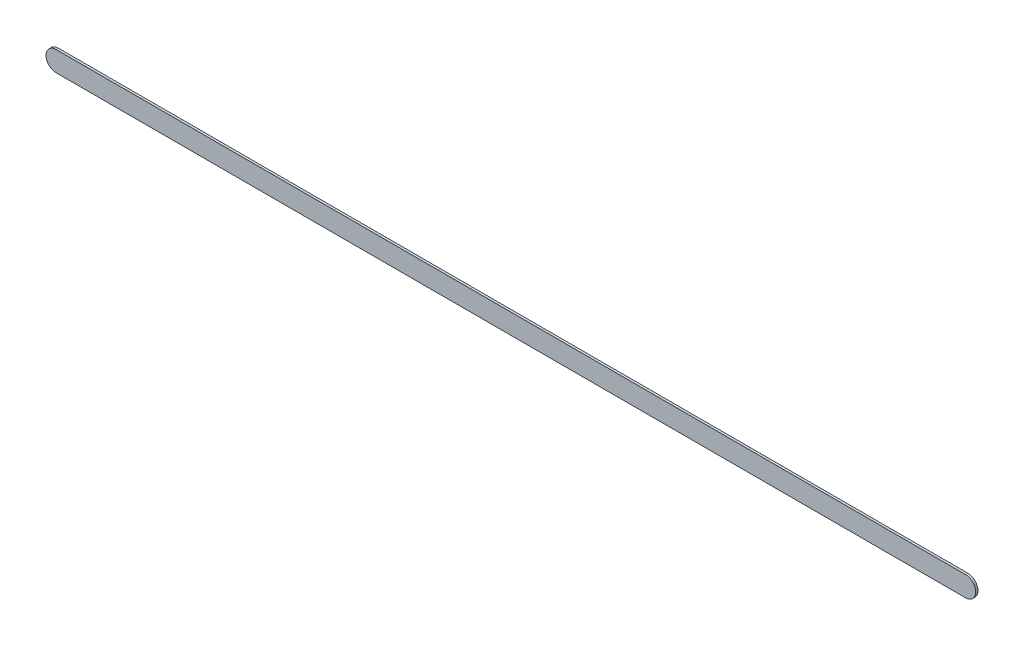
ISO-10303-21;
HEADER;
FILE_DESCRIPTION(('STEP AP214'),'2;1');
FILE_NAME('part.step','',(''),(''),'','','');
FILE_SCHEMA(('AUTOMOTIVE_DESIGN { 1 0 10303 214 1 1 1 1 }'));
ENDSEC;
DATA;
#1=APPLICATION_CONTEXT('core data for automotive mechanical design processes');
#2=APPLICATION_PROTOCOL_DEFINITION('international standard','automotive_design',2000,#1);
#3=PRODUCT_CONTEXT('',#1,'mechanical');
#4=PRODUCT('Part','Part','',(#3));
#5=PRODUCT_RELATED_PRODUCT_CATEGORY('part','',(#4));
#6=PRODUCT_DEFINITION_FORMATION('','',#4);
#7=PRODUCT_DEFINITION_CONTEXT('part definition',#1,'design');
#8=PRODUCT_DEFINITION('design','',#6,#7);
#9=PRODUCT_DEFINITION_SHAPE('','',#8);
#10=(LENGTH_UNIT() NAMED_UNIT(*) SI_UNIT(.MILLI.,.METRE.));
#11=(NAMED_UNIT(*) PLANE_ANGLE_UNIT() SI_UNIT($,.RADIAN.));
#12=(NAMED_UNIT(*) SI_UNIT($,.STERADIAN.) SOLID_ANGLE_UNIT());
#13=UNCERTAINTY_MEASURE_WITH_UNIT(LENGTH_MEASURE(1.E-05),#10,'distance_accuracy_value','');
#14=(GEOMETRIC_REPRESENTATION_CONTEXT(3) GLOBAL_UNCERTAINTY_ASSIGNED_CONTEXT((#13)) GLOBAL_UNIT_ASSIGNED_CONTEXT((#10,
#11,#12)) REPRESENTATION_CONTEXT('',''));
#15=CARTESIAN_POINT('',(0.,0.,0.));
#16=DIRECTION('',(0.,0.,1.));
#17=DIRECTION('',(1.,0.,0.));
#18=AXIS2_PLACEMENT_3D('',#15,#16,#17);
#19=CARTESIAN_POINT('',(119.82,-123.08,1.635));
#20=DIRECTION('',(0.,0.,1.));
#21=DIRECTION('',(1.,0.,0.));
#22=AXIS2_PLACEMENT_3D('',#19,#20,#21);
#23=PLANE('',#22);
#24=DIRECTION('',(-1.,0.,0.));
#25=VECTOR('',#24,1.);
#26=CARTESIAN_POINT('',(119.82,-123.08,1.635));
#27=LINE('',#26,#25);
#28=CARTESIAN_POINT('',(119.82,-123.08,1.635));
#29=VERTEX_POINT('',#28);
#30=CARTESIAN_POINT('',(106.28,-123.08,1.635));
#31=VERTEX_POINT('',#30);
#32=EDGE_CURVE('E94',#29,#31,#27,.T.);
#33=ORIENTED_EDGE('',*,*,#32,.T.);
#34=CARTESIAN_POINT('',(106.28,-123.23,1.635));
#35=DIRECTION('',(0.,0.,1.));
#36=DIRECTION('',(0.,1.,0.));
#37=AXIS2_PLACEMENT_3D('',#34,#35,#36);
#38=CIRCLE('',#37,0.15);
#39=CARTESIAN_POINT('',(106.28,-123.38,1.635));
#40=VERTEX_POINT('',#39);
#41=EDGE_CURVE('E72',#31,#40,#38,.T.);
#42=ORIENTED_EDGE('',*,*,#41,.T.);
#43=DIRECTION('',(1.,0.,0.));
#44=VECTOR('',#43,1.);
#45=CARTESIAN_POINT('',(106.28,-123.38,1.635));
#46=LINE('',#45,#44);
#47=CARTESIAN_POINT('',(119.82,-123.38,1.635));
#48=VERTEX_POINT('',#47);
#49=EDGE_CURVE('E77',#40,#48,#46,.T.);
#50=ORIENTED_EDGE('',*,*,#49,.T.);
#51=CARTESIAN_POINT('',(119.82,-123.23,1.635));
#52=DIRECTION('',(0.,0.,1.));
#53=DIRECTION('',(0.,-1.,0.));
#54=AXIS2_PLACEMENT_3D('',#51,#52,#53);
#55=CIRCLE('',#54,0.15);
#56=EDGE_CURVE('E11',#48,#29,#55,.T.);
#57=ORIENTED_EDGE('',*,*,#56,.T.);
#58=EDGE_LOOP('',(#33,#42,#50,#57));
#59=FACE_BOUND('',#58,.T.);
#60=ADVANCED_FACE('F17',(#59),#23,.T.);
#61=CARTESIAN_POINT('',(119.82,-123.08,1.6));
#62=DIRECTION('',(0.,0.,1.));
#63=DIRECTION('',(1.,0.,0.));
#64=AXIS2_PLACEMENT_3D('',#61,#62,#63);
#65=PLANE('',#64);
#66=CARTESIAN_POINT('',(119.82,-123.23,1.6));
#67=DIRECTION('',(0.,0.,1.));
#68=DIRECTION('',(0.,-1.,0.));
#69=AXIS2_PLACEMENT_3D('',#66,#67,#68);
#70=CIRCLE('',#69,0.15);
#71=CARTESIAN_POINT('',(119.82,-123.38,1.6));
#72=VERTEX_POINT('',#71);
#73=CARTESIAN_POINT('',(119.82,-123.08,1.6));
#74=VERTEX_POINT('',#73);
#75=EDGE_CURVE('E26',#72,#74,#70,.T.);
#76=ORIENTED_EDGE('',*,*,#75,.F.);
#77=DIRECTION('',(1.,0.,0.));
#78=VECTOR('',#77,1.);
#79=CARTESIAN_POINT('',(106.28,-123.38,1.6));
#80=LINE('',#79,#78);
#81=CARTESIAN_POINT('',(106.28,-123.38,1.6));
#82=VERTEX_POINT('',#81);
#83=EDGE_CURVE('E61',#82,#72,#80,.T.);
#84=ORIENTED_EDGE('',*,*,#83,.F.);
#85=CARTESIAN_POINT('',(106.28,-123.23,1.6));
#86=DIRECTION('',(0.,0.,1.));
#87=DIRECTION('',(0.,1.,0.));
#88=AXIS2_PLACEMENT_3D('',#85,#86,#87);
#89=CIRCLE('',#88,0.15);
#90=CARTESIAN_POINT('',(106.28,-123.08,1.6));
#91=VERTEX_POINT('',#90);
#92=EDGE_CURVE('E66',#91,#82,#89,.T.);
#93=ORIENTED_EDGE('',*,*,#92,.F.);
#94=DIRECTION('',(-1.,0.,0.));
#95=VECTOR('',#94,1.);
#96=CARTESIAN_POINT('',(119.82,-123.08,1.6));
#97=LINE('',#96,#95);
#98=EDGE_CURVE('E112',#74,#91,#97,.T.);
#99=ORIENTED_EDGE('',*,*,#98,.F.);
#100=EDGE_LOOP('',(#76,#84,#93,#99));
#101=FACE_BOUND('',#100,.T.);
#102=ADVANCED_FACE('F63',(#101),#65,.F.);
#103=CARTESIAN_POINT('',(119.82,-123.23,1.6));
#104=DIRECTION('',(0.,0.,-1.));
#105=DIRECTION('',(0.,-1.,0.));
#106=AXIS2_PLACEMENT_3D('',#103,#104,#105);
#107=CYLINDRICAL_SURFACE('',#106,0.15);
#108=ORIENTED_EDGE('',*,*,#75,.T.);
#109=DIRECTION('',(0.,0.,1.));
#110=VECTOR('',#109,1.);
#111=CARTESIAN_POINT('',(119.82,-123.08,1.6));
#112=LINE('',#111,#110);
#113=EDGE_CURVE('E88',#74,#29,#112,.T.);
#114=ORIENTED_EDGE('',*,*,#113,.T.);
#115=ORIENTED_EDGE('',*,*,#56,.F.);
#116=DIRECTION('',(0.,0.,1.));
#117=VECTOR('',#116,1.);
#118=CARTESIAN_POINT('',(119.82,-123.38,1.6));
#119=LINE('',#118,#117);
#120=EDGE_CURVE('E71',#72,#48,#119,.T.);
#121=ORIENTED_EDGE('',*,*,#120,.F.);
#122=EDGE_LOOP('',(#108,#114,#115,#121));
#123=FACE_BOUND('',#122,.T.);
#124=ADVANCED_FACE('F19',(#123),#107,.T.);
#125=CARTESIAN_POINT('',(106.28,-123.38,1.6));
#126=DIRECTION('',(0.,1.,0.));
#127=DIRECTION('',(1.,0.,0.));
#128=AXIS2_PLACEMENT_3D('',#125,#126,#127);
#129=PLANE('',#128);
#130=ORIENTED_EDGE('',*,*,#83,.T.);
#131=ORIENTED_EDGE('',*,*,#120,.T.);
#132=ORIENTED_EDGE('',*,*,#49,.F.);
#133=DIRECTION('',(0.,0.,1.));
#134=VECTOR('',#133,1.);
#135=CARTESIAN_POINT('',(106.28,-123.38,1.6));
#136=LINE('',#135,#134);
#137=EDGE_CURVE('E75',#82,#40,#136,.T.);
#138=ORIENTED_EDGE('',*,*,#137,.F.);
#139=EDGE_LOOP('',(#130,#131,#132,#138));
#140=FACE_BOUND('',#139,.T.);
#141=ADVANCED_FACE('F76',(#140),#129,.F.);
#142=CARTESIAN_POINT('',(106.28,-123.23,1.6));
#143=DIRECTION('',(0.,0.,-1.));
#144=DIRECTION('',(0.,1.,0.));
#145=AXIS2_PLACEMENT_3D('',#142,#143,#144);
#146=CYLINDRICAL_SURFACE('',#145,0.15);
#147=ORIENTED_EDGE('',*,*,#92,.T.);
#148=ORIENTED_EDGE('',*,*,#137,.T.);
#149=ORIENTED_EDGE('',*,*,#41,.F.);
#150=DIRECTION('',(0.,0.,1.));
#151=VECTOR('',#150,1.);
#152=CARTESIAN_POINT('',(106.28,-123.08,1.6));
#153=LINE('',#152,#151);
#154=EDGE_CURVE('E85',#91,#31,#153,.T.);
#155=ORIENTED_EDGE('',*,*,#154,.F.);
#156=EDGE_LOOP('',(#147,#148,#149,#155));
#157=FACE_BOUND('',#156,.T.);
#158=ADVANCED_FACE('F83',(#157),#146,.T.);
#159=CARTESIAN_POINT('',(119.82,-123.08,1.6));
#160=DIRECTION('',(0.,-1.,0.));
#161=DIRECTION('',(0.,0.,-1.));
#162=AXIS2_PLACEMENT_3D('',#159,#160,#161);
#163=PLANE('',#162);
#164=ORIENTED_EDGE('',*,*,#98,.T.);
#165=ORIENTED_EDGE('',*,*,#154,.T.);
#166=ORIENTED_EDGE('',*,*,#32,.F.);
#167=ORIENTED_EDGE('',*,*,#113,.F.);
#168=EDGE_LOOP('',(#164,#165,#166,#167));
#169=FACE_BOUND('',#168,.T.);
#170=ADVANCED_FACE('F111',(#169),#163,.F.);
#171=CLOSED_SHELL('',(#60,#102,#124,#141,#158,#170));
#172=MANIFOLD_SOLID_BREP('B1',#171);
#173=ADVANCED_BREP_SHAPE_REPRESENTATION('',(#18,#172),#14);
#174=SHAPE_DEFINITION_REPRESENTATION(#9,#173);
ENDSEC;
END-ISO-10303-21;
